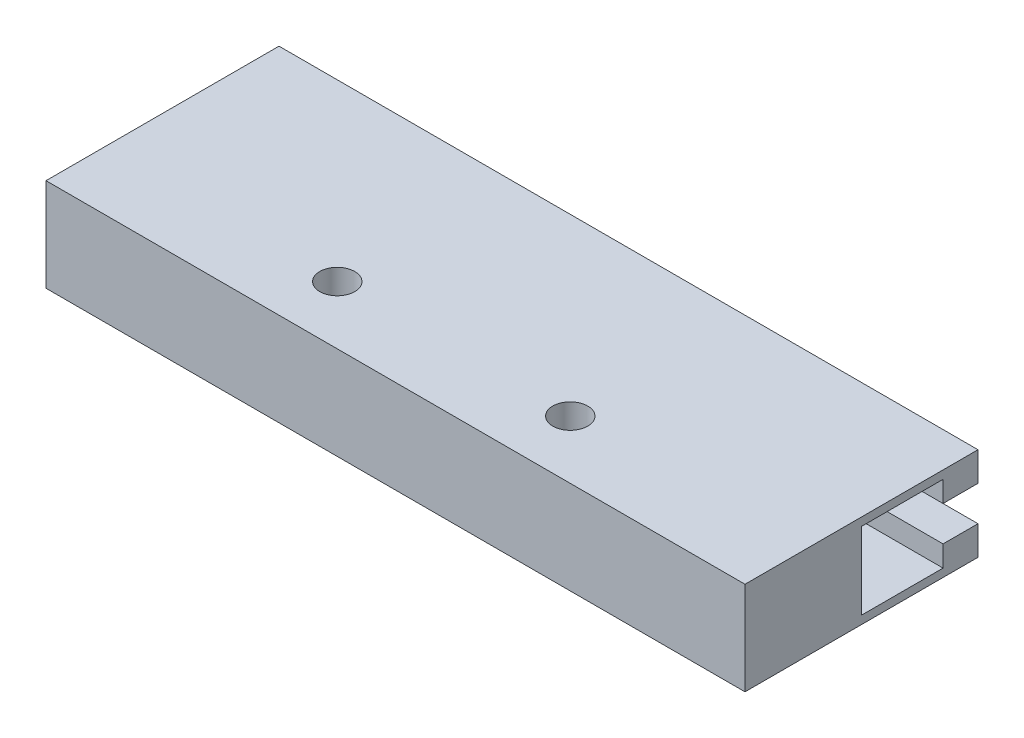
ISO-10303-21;
HEADER;
FILE_DESCRIPTION(('STEP AP214'),'2;1');
FILE_NAME('part.step','',(''),(''),'','','');
FILE_SCHEMA(('AUTOMOTIVE_DESIGN { 1 0 10303 214 1 1 1 1 }'));
ENDSEC;
DATA;
#1=APPLICATION_CONTEXT('core data for automotive mechanical design processes');
#2=APPLICATION_PROTOCOL_DEFINITION('international standard','automotive_design',2000,#1);
#3=PRODUCT_CONTEXT('',#1,'mechanical');
#4=PRODUCT('Part','Part','',(#3));
#5=PRODUCT_RELATED_PRODUCT_CATEGORY('part','',(#4));
#6=PRODUCT_DEFINITION_FORMATION('','',#4);
#7=PRODUCT_DEFINITION_CONTEXT('part definition',#1,'design');
#8=PRODUCT_DEFINITION('design','',#6,#7);
#9=PRODUCT_DEFINITION_SHAPE('','',#8);
#10=(LENGTH_UNIT() NAMED_UNIT(*) SI_UNIT(.MILLI.,.METRE.));
#11=(NAMED_UNIT(*) PLANE_ANGLE_UNIT() SI_UNIT($,.RADIAN.));
#12=(NAMED_UNIT(*) SI_UNIT($,.STERADIAN.) SOLID_ANGLE_UNIT());
#13=UNCERTAINTY_MEASURE_WITH_UNIT(LENGTH_MEASURE(1.E-05),#10,'distance_accuracy_value','');
#14=(GEOMETRIC_REPRESENTATION_CONTEXT(3) GLOBAL_UNCERTAINTY_ASSIGNED_CONTEXT((#13)) GLOBAL_UNIT_ASSIGNED_CONTEXT((#10,
#11,#12)) REPRESENTATION_CONTEXT('',''));
#15=CARTESIAN_POINT('',(0.,0.,0.));
#16=DIRECTION('',(0.,0.,1.));
#17=DIRECTION('',(1.,0.,0.));
#18=AXIS2_PLACEMENT_3D('',#15,#16,#17);
#19=CARTESIAN_POINT('',(0.,0.,0.));
#20=DIRECTION('',(0.,0.,-1.));
#21=DIRECTION('',(-1.,0.,0.));
#22=AXIS2_PLACEMENT_3D('',#19,#20,#21);
#23=PLANE('',#22);
#24=DIRECTION('',(1.,0.,0.));
#25=VECTOR('',#24,1.);
#26=CARTESIAN_POINT('',(0.,-5.5,0.));
#27=LINE('',#26,#25);
#28=CARTESIAN_POINT('',(0.,-5.5,0.));
#29=VERTEX_POINT('',#28);
#30=CARTESIAN_POINT('',(60.,-5.5,0.));
#31=VERTEX_POINT('',#30);
#32=EDGE_CURVE('E215',#29,#31,#27,.T.);
#33=ORIENTED_EDGE('',*,*,#32,.T.);
#34=DIRECTION('',(0.,1.,0.));
#35=VECTOR('',#34,1.);
#36=CARTESIAN_POINT('',(60.,0.,0.));
#37=LINE('',#36,#35);
#38=CARTESIAN_POINT('',(60.,-8.,0.));
#39=VERTEX_POINT('',#38);
#40=EDGE_CURVE('E253',#39,#31,#37,.T.);
#41=ORIENTED_EDGE('',*,*,#40,.F.);
#42=DIRECTION('',(1.,0.,0.));
#43=VECTOR('',#42,1.);
#44=CARTESIAN_POINT('',(60.,-8.,0.));
#45=LINE('',#44,#43);
#46=CARTESIAN_POINT('',(0.,-7.99999999999999,0.));
#47=VERTEX_POINT('',#46);
#48=EDGE_CURVE('E249',#47,#39,#45,.T.);
#49=ORIENTED_EDGE('',*,*,#48,.F.);
#50=DIRECTION('',(0.,-1.,0.));
#51=VECTOR('',#50,1.);
#52=CARTESIAN_POINT('',(0.,-7.99999999999999,0.));
#53=LINE('',#52,#51);
#54=EDGE_CURVE('E219',#29,#47,#53,.T.);
#55=ORIENTED_EDGE('',*,*,#54,.F.);
#56=EDGE_LOOP('',(#33,#41,#49,#55));
#57=FACE_BOUND('',#56,.T.);
#58=ADVANCED_FACE('F45',(#57),#23,.T.);
#59=CARTESIAN_POINT('',(0.,-7.99999999999999,20.));
#60=DIRECTION('',(1.,0.,0.));
#61=DIRECTION('',(0.,0.,-1.));
#62=AXIS2_PLACEMENT_3D('',#59,#60,#61);
#63=PLANE('',#62);
#64=DIRECTION('',(0.,1.,0.));
#65=VECTOR('',#64,1.);
#66=CARTESIAN_POINT('',(0.,-7.3,3.));
#67=LINE('',#66,#65);
#68=CARTESIAN_POINT('',(0.,-7.3,3.));
#69=VERTEX_POINT('',#68);
#70=CARTESIAN_POINT('',(0.,-5.5,3.));
#71=VERTEX_POINT('',#70);
#72=EDGE_CURVE('E187',#69,#71,#67,.T.);
#73=ORIENTED_EDGE('',*,*,#72,.T.);
#74=DIRECTION('',(0.,0.,-1.));
#75=VECTOR('',#74,1.);
#76=CARTESIAN_POINT('',(0.,-5.5,3.));
#77=LINE('',#76,#75);
#78=EDGE_CURVE('E190',#71,#29,#77,.T.);
#79=ORIENTED_EDGE('',*,*,#78,.T.);
#80=ORIENTED_EDGE('',*,*,#54,.T.);
#81=DIRECTION('',(0.,0.,-1.));
#82=VECTOR('',#81,1.);
#83=CARTESIAN_POINT('',(0.,-7.99999999999999,20.));
#84=LINE('',#83,#82);
#85=CARTESIAN_POINT('',(0.,-7.99999999999999,20.));
#86=VERTEX_POINT('',#85);
#87=EDGE_CURVE('E11',#86,#47,#84,.T.);
#88=ORIENTED_EDGE('',*,*,#87,.F.);
#89=DIRECTION('',(0.,-1.,0.));
#90=VECTOR('',#89,1.);
#91=CARTESIAN_POINT('',(0.,-7.99999999999999,20.));
#92=LINE('',#91,#90);
#93=CARTESIAN_POINT('',(0.,0.,20.));
#94=VERTEX_POINT('',#93);
#95=EDGE_CURVE('E236',#94,#86,#92,.T.);
#96=ORIENTED_EDGE('',*,*,#95,.F.);
#97=DIRECTION('',(0.,0.,-1.));
#98=VECTOR('',#97,1.);
#99=CARTESIAN_POINT('',(0.,0.,20.));
#100=LINE('',#99,#98);
#101=CARTESIAN_POINT('',(0.,0.,0.));
#102=VERTEX_POINT('',#101);
#103=EDGE_CURVE('E246',#94,#102,#100,.T.);
#104=ORIENTED_EDGE('',*,*,#103,.T.);
#105=CARTESIAN_POINT('',(0.,-2.49999999999999,0.));
#106=VERTEX_POINT('',#105);
#107=EDGE_CURVE('E166',#102,#106,#53,.T.);
#108=ORIENTED_EDGE('',*,*,#107,.T.);
#109=DIRECTION('',(0.,0.,1.));
#110=VECTOR('',#109,1.);
#111=CARTESIAN_POINT('',(0.,-2.49999999999999,0.));
#112=LINE('',#111,#110);
#113=CARTESIAN_POINT('',(0.,-2.49999999999999,3.));
#114=VERTEX_POINT('',#113);
#115=EDGE_CURVE('E61',#106,#114,#112,.T.);
#116=ORIENTED_EDGE('',*,*,#115,.T.);
#117=DIRECTION('',(0.,1.,0.));
#118=VECTOR('',#117,1.);
#119=CARTESIAN_POINT('',(0.,-2.49999999999999,3.));
#120=LINE('',#119,#118);
#121=CARTESIAN_POINT('',(0.,-0.699999999999995,3.));
#122=VERTEX_POINT('',#121);
#123=EDGE_CURVE('E155',#114,#122,#120,.T.);
#124=ORIENTED_EDGE('',*,*,#123,.T.);
#125=DIRECTION('',(0.,0.,1.));
#126=VECTOR('',#125,1.);
#127=CARTESIAN_POINT('',(0.,-0.699999999999995,3.));
#128=LINE('',#127,#126);
#129=CARTESIAN_POINT('',(0.,-0.699999999999995,10.));
#130=VERTEX_POINT('',#129);
#131=EDGE_CURVE('E161',#122,#130,#128,.T.);
#132=ORIENTED_EDGE('',*,*,#131,.T.);
#133=DIRECTION('',(0.,-1.,0.));
#134=VECTOR('',#133,1.);
#135=CARTESIAN_POINT('',(0.,-0.699999999999995,10.));
#136=LINE('',#135,#134);
#137=CARTESIAN_POINT('',(0.,-7.3,10.));
#138=VERTEX_POINT('',#137);
#139=EDGE_CURVE('E179',#130,#138,#136,.T.);
#140=ORIENTED_EDGE('',*,*,#139,.T.);
#141=DIRECTION('',(0.,0.,-1.));
#142=VECTOR('',#141,1.);
#143=CARTESIAN_POINT('',(0.,-7.3,10.));
#144=LINE('',#143,#142);
#145=EDGE_CURVE('E183',#138,#69,#144,.T.);
#146=ORIENTED_EDGE('',*,*,#145,.T.);
#147=EDGE_LOOP('',(#73,#79,#80,#88,#96,#104,#108,#116,#124,#132,#140,#146));
#148=FACE_BOUND('',#147,.T.);
#149=ADVANCED_FACE('F47',(#148),#63,.F.);
#150=CARTESIAN_POINT('',(60.,-8.,20.));
#151=DIRECTION('',(0.,1.,0.));
#152=DIRECTION('',(-1.,0.,0.));
#153=AXIS2_PLACEMENT_3D('',#150,#151,#152);
#154=PLANE('',#153);
#155=CARTESIAN_POINT('',(40.,-8.,15.));
#156=DIRECTION('',(0.,1.,0.));
#157=DIRECTION('',(0.,0.,1.));
#158=AXIS2_PLACEMENT_3D('',#155,#156,#157);
#159=CIRCLE('',#158,1.5);
#160=CARTESIAN_POINT('',(40.,-8.,16.5));
#161=VERTEX_POINT('',#160);
#162=EDGE_CURVE('E197',#161,#161,#159,.T.);
#163=ORIENTED_EDGE('',*,*,#162,.T.);
#164=EDGE_LOOP('',(#163));
#165=FACE_BOUND('',#164,.T.);
#166=CARTESIAN_POINT('',(20.,-8.,15.));
#167=DIRECTION('',(0.,1.,0.));
#168=DIRECTION('',(0.,0.,1.));
#169=AXIS2_PLACEMENT_3D('',#166,#167,#168);
#170=CIRCLE('',#169,1.5);
#171=CARTESIAN_POINT('',(20.,-8.,16.5));
#172=VERTEX_POINT('',#171);
#173=EDGE_CURVE('E174',#172,#172,#170,.T.);
#174=ORIENTED_EDGE('',*,*,#173,.T.);
#175=EDGE_LOOP('',(#174));
#176=FACE_BOUND('',#175,.T.);
#177=ORIENTED_EDGE('',*,*,#48,.T.);
#178=DIRECTION('',(0.,0.,-1.));
#179=VECTOR('',#178,1.);
#180=CARTESIAN_POINT('',(60.,-8.,20.));
#181=LINE('',#180,#179);
#182=CARTESIAN_POINT('',(60.,-8.,20.));
#183=VERTEX_POINT('',#182);
#184=EDGE_CURVE('E54',#183,#39,#181,.T.);
#185=ORIENTED_EDGE('',*,*,#184,.F.);
#186=DIRECTION('',(1.,0.,0.));
#187=VECTOR('',#186,1.);
#188=CARTESIAN_POINT('',(60.,-8.,20.));
#189=LINE('',#188,#187);
#190=EDGE_CURVE('E98',#86,#183,#189,.T.);
#191=ORIENTED_EDGE('',*,*,#190,.F.);
#192=ORIENTED_EDGE('',*,*,#87,.T.);
#193=EDGE_LOOP('',(#177,#185,#191,#192));
#194=FACE_BOUND('',#193,.T.);
#195=ADVANCED_FACE('F314',(#165,#176,#194),#154,.F.);
#196=CARTESIAN_POINT('',(60.,0.,20.));
#197=DIRECTION('',(-1.,0.,0.));
#198=DIRECTION('',(0.,0.,1.));
#199=AXIS2_PLACEMENT_3D('',#196,#197,#198);
#200=PLANE('',#199);
#201=ORIENTED_EDGE('',*,*,#40,.T.);
#202=DIRECTION('',(0.,0.,-1.));
#203=VECTOR('',#202,1.);
#204=CARTESIAN_POINT('',(60.,-5.5,3.));
#205=LINE('',#204,#203);
#206=CARTESIAN_POINT('',(60.,-5.5,3.));
#207=VERTEX_POINT('',#206);
#208=EDGE_CURVE('E168',#207,#31,#205,.T.);
#209=ORIENTED_EDGE('',*,*,#208,.F.);
#210=DIRECTION('',(0.,1.,0.));
#211=VECTOR('',#210,1.);
#212=CARTESIAN_POINT('',(60.,-7.3,3.));
#213=LINE('',#212,#211);
#214=CARTESIAN_POINT('',(60.,-7.3,3.));
#215=VERTEX_POINT('',#214);
#216=EDGE_CURVE('E171',#215,#207,#213,.T.);
#217=ORIENTED_EDGE('',*,*,#216,.F.);
#218=DIRECTION('',(0.,0.,-1.));
#219=VECTOR('',#218,1.);
#220=CARTESIAN_POINT('',(60.,-7.3,10.));
#221=LINE('',#220,#219);
#222=CARTESIAN_POINT('',(60.,-7.3,10.));
#223=VERTEX_POINT('',#222);
#224=EDGE_CURVE('E208',#223,#215,#221,.T.);
#225=ORIENTED_EDGE('',*,*,#224,.F.);
#226=DIRECTION('',(0.,-1.,0.));
#227=VECTOR('',#226,1.);
#228=CARTESIAN_POINT('',(60.,-0.699999999999995,10.));
#229=LINE('',#228,#227);
#230=CARTESIAN_POINT('',(60.,-0.699999999999995,10.));
#231=VERTEX_POINT('',#230);
#232=EDGE_CURVE('E204',#231,#223,#229,.T.);
#233=ORIENTED_EDGE('',*,*,#232,.F.);
#234=DIRECTION('',(0.,0.,1.));
#235=VECTOR('',#234,1.);
#236=CARTESIAN_POINT('',(60.,-0.699999999999995,3.));
#237=LINE('',#236,#235);
#238=CARTESIAN_POINT('',(60.,-0.699999999999995,3.));
#239=VERTEX_POINT('',#238);
#240=EDGE_CURVE('E200',#239,#231,#237,.T.);
#241=ORIENTED_EDGE('',*,*,#240,.F.);
#242=DIRECTION('',(0.,1.,0.));
#243=VECTOR('',#242,1.);
#244=CARTESIAN_POINT('',(60.,-2.49999999999999,3.));
#245=LINE('',#244,#243);
#246=CARTESIAN_POINT('',(60.,-2.49999999999999,3.));
#247=VERTEX_POINT('',#246);
#248=EDGE_CURVE('E196',#247,#239,#245,.T.);
#249=ORIENTED_EDGE('',*,*,#248,.F.);
#250=DIRECTION('',(0.,0.,1.));
#251=VECTOR('',#250,1.);
#252=CARTESIAN_POINT('',(60.,-2.49999999999999,0.));
#253=LINE('',#252,#251);
#254=CARTESIAN_POINT('',(60.,-2.49999999999999,0.));
#255=VERTEX_POINT('',#254);
#256=EDGE_CURVE('E146',#255,#247,#253,.T.);
#257=ORIENTED_EDGE('',*,*,#256,.F.);
#258=CARTESIAN_POINT('',(60.,0.,0.));
#259=VERTEX_POINT('',#258);
#260=EDGE_CURVE('E252',#255,#259,#37,.T.);
#261=ORIENTED_EDGE('',*,*,#260,.T.);
#262=DIRECTION('',(0.,0.,-1.));
#263=VECTOR('',#262,1.);
#264=CARTESIAN_POINT('',(60.,0.,20.));
#265=LINE('',#264,#263);
#266=CARTESIAN_POINT('',(60.,0.,20.));
#267=VERTEX_POINT('',#266);
#268=EDGE_CURVE('E261',#267,#259,#265,.T.);
#269=ORIENTED_EDGE('',*,*,#268,.F.);
#270=DIRECTION('',(0.,1.,0.));
#271=VECTOR('',#270,1.);
#272=CARTESIAN_POINT('',(60.,0.,20.));
#273=LINE('',#272,#271);
#274=EDGE_CURVE('E241',#183,#267,#273,.T.);
#275=ORIENTED_EDGE('',*,*,#274,.F.);
#276=ORIENTED_EDGE('',*,*,#184,.T.);
#277=EDGE_LOOP('',(#201,#209,#217,#225,#233,#241,#249,#257,#261,#269,#275,#276));
#278=FACE_BOUND('',#277,.T.);
#279=ADVANCED_FACE('F268',(#278),#200,.F.);
#280=CARTESIAN_POINT('',(0.,0.,20.));
#281=DIRECTION('',(0.,-1.,0.));
#282=DIRECTION('',(0.,0.,-1.));
#283=AXIS2_PLACEMENT_3D('',#280,#281,#282);
#284=PLANE('',#283);
#285=CARTESIAN_POINT('',(40.,0.,15.));
#286=DIRECTION('',(0.,1.,0.));
#287=DIRECTION('',(0.,0.,1.));
#288=AXIS2_PLACEMENT_3D('',#285,#286,#287);
#289=CIRCLE('',#288,1.5);
#290=CARTESIAN_POINT('',(40.,0.,16.5));
#291=VERTEX_POINT('',#290);
#292=EDGE_CURVE('E333',#291,#291,#289,.T.);
#293=ORIENTED_EDGE('',*,*,#292,.F.);
#294=EDGE_LOOP('',(#293));
#295=FACE_BOUND('',#294,.T.);
#296=CARTESIAN_POINT('',(20.,0.,15.));
#297=DIRECTION('',(0.,1.,0.));
#298=DIRECTION('',(0.,0.,1.));
#299=AXIS2_PLACEMENT_3D('',#296,#297,#298);
#300=CIRCLE('',#299,1.5);
#301=CARTESIAN_POINT('',(20.,0.,16.5));
#302=VERTEX_POINT('',#301);
#303=EDGE_CURVE('E336',#302,#302,#300,.T.);
#304=ORIENTED_EDGE('',*,*,#303,.F.);
#305=EDGE_LOOP('',(#304));
#306=FACE_BOUND('',#305,.T.);
#307=DIRECTION('',(-1.,0.,0.));
#308=VECTOR('',#307,1.);
#309=CARTESIAN_POINT('',(0.,0.,0.));
#310=LINE('',#309,#308);
#311=EDGE_CURVE('E91',#259,#102,#310,.T.);
#312=ORIENTED_EDGE('',*,*,#311,.T.);
#313=ORIENTED_EDGE('',*,*,#103,.F.);
#314=DIRECTION('',(-1.,0.,0.));
#315=VECTOR('',#314,1.);
#316=CARTESIAN_POINT('',(0.,0.,20.));
#317=LINE('',#316,#315);
#318=EDGE_CURVE('E70',#267,#94,#317,.T.);
#319=ORIENTED_EDGE('',*,*,#318,.F.);
#320=ORIENTED_EDGE('',*,*,#268,.T.);
#321=EDGE_LOOP('',(#312,#313,#319,#320));
#322=FACE_BOUND('',#321,.T.);
#323=ADVANCED_FACE('F307',(#295,#306,#322),#284,.F.);
#324=CARTESIAN_POINT('',(0.,0.,20.));
#325=DIRECTION('',(0.,0.,-1.));
#326=DIRECTION('',(-1.,0.,0.));
#327=AXIS2_PLACEMENT_3D('',#324,#325,#326);
#328=PLANE('',#327);
#329=ORIENTED_EDGE('',*,*,#95,.T.);
#330=ORIENTED_EDGE('',*,*,#190,.T.);
#331=ORIENTED_EDGE('',*,*,#274,.T.);
#332=ORIENTED_EDGE('',*,*,#318,.T.);
#333=EDGE_LOOP('',(#329,#330,#331,#332));
#334=FACE_BOUND('',#333,.T.);
#335=ADVANCED_FACE('F299',(#334),#328,.F.);
#336=DIRECTION('',(1.,0.,0.));
#337=VECTOR('',#336,1.);
#338=CARTESIAN_POINT('',(0.,-2.49999999999999,0.));
#339=LINE('',#338,#337);
#340=EDGE_CURVE('E152',#106,#255,#339,.T.);
#341=ORIENTED_EDGE('',*,*,#340,.F.);
#342=ORIENTED_EDGE('',*,*,#107,.F.);
#343=ORIENTED_EDGE('',*,*,#311,.F.);
#344=ORIENTED_EDGE('',*,*,#260,.F.);
#345=EDGE_LOOP('',(#341,#342,#343,#344));
#346=FACE_BOUND('',#345,.T.);
#347=ADVANCED_FACE('F295',(#346),#23,.T.);
#348=CARTESIAN_POINT('',(0.,-5.5,3.));
#349=DIRECTION('',(0.,-1.,0.));
#350=DIRECTION('',(0.,0.,-1.));
#351=AXIS2_PLACEMENT_3D('',#348,#349,#350);
#352=PLANE('',#351);
#353=ORIENTED_EDGE('',*,*,#208,.T.);
#354=ORIENTED_EDGE('',*,*,#32,.F.);
#355=ORIENTED_EDGE('',*,*,#78,.F.);
#356=DIRECTION('',(1.,0.,0.));
#357=VECTOR('',#356,1.);
#358=CARTESIAN_POINT('',(0.,-5.5,3.));
#359=LINE('',#358,#357);
#360=EDGE_CURVE('E220',#71,#207,#359,.T.);
#361=ORIENTED_EDGE('',*,*,#360,.T.);
#362=EDGE_LOOP('',(#353,#354,#355,#361));
#363=FACE_BOUND('',#362,.T.);
#364=ADVANCED_FACE('F276',(#363),#352,.F.);
#365=CARTESIAN_POINT('',(0.,-7.3,3.));
#366=DIRECTION('',(0.,0.,-1.));
#367=DIRECTION('',(-1.,0.,0.));
#368=AXIS2_PLACEMENT_3D('',#365,#366,#367);
#369=PLANE('',#368);
#370=ORIENTED_EDGE('',*,*,#216,.T.);
#371=ORIENTED_EDGE('',*,*,#360,.F.);
#372=ORIENTED_EDGE('',*,*,#72,.F.);
#373=DIRECTION('',(1.,0.,0.));
#374=VECTOR('',#373,1.);
#375=CARTESIAN_POINT('',(0.,-7.3,3.));
#376=LINE('',#375,#374);
#377=EDGE_CURVE('E223',#69,#215,#376,.T.);
#378=ORIENTED_EDGE('',*,*,#377,.T.);
#379=EDGE_LOOP('',(#370,#371,#372,#378));
#380=FACE_BOUND('',#379,.T.);
#381=ADVANCED_FACE('F281',(#380),#369,.F.);
#382=CARTESIAN_POINT('',(0.,-7.3,10.));
#383=DIRECTION('',(0.,-1.,0.));
#384=DIRECTION('',(0.,0.,-1.));
#385=AXIS2_PLACEMENT_3D('',#382,#383,#384);
#386=PLANE('',#385);
#387=ORIENTED_EDGE('',*,*,#224,.T.);
#388=ORIENTED_EDGE('',*,*,#377,.F.);
#389=ORIENTED_EDGE('',*,*,#145,.F.);
#390=DIRECTION('',(1.,0.,0.));
#391=VECTOR('',#390,1.);
#392=CARTESIAN_POINT('',(0.,-7.3,10.));
#393=LINE('',#392,#391);
#394=EDGE_CURVE('E226',#138,#223,#393,.T.);
#395=ORIENTED_EDGE('',*,*,#394,.T.);
#396=EDGE_LOOP('',(#387,#388,#389,#395));
#397=FACE_BOUND('',#396,.T.);
#398=ADVANCED_FACE('F287',(#397),#386,.F.);
#399=CARTESIAN_POINT('',(0.,-0.699999999999995,10.));
#400=DIRECTION('',(0.,0.,1.));
#401=DIRECTION('',(0.,-1.,0.));
#402=AXIS2_PLACEMENT_3D('',#399,#400,#401);
#403=PLANE('',#402);
#404=ORIENTED_EDGE('',*,*,#232,.T.);
#405=ORIENTED_EDGE('',*,*,#394,.F.);
#406=ORIENTED_EDGE('',*,*,#139,.F.);
#407=DIRECTION('',(1.,0.,0.));
#408=VECTOR('',#407,1.);
#409=CARTESIAN_POINT('',(0.,-0.699999999999995,10.));
#410=LINE('',#409,#408);
#411=EDGE_CURVE('E229',#130,#231,#410,.T.);
#412=ORIENTED_EDGE('',*,*,#411,.T.);
#413=EDGE_LOOP('',(#404,#405,#406,#412));
#414=FACE_BOUND('',#413,.T.);
#415=ADVANCED_FACE('F290',(#414),#403,.F.);
#416=CARTESIAN_POINT('',(0.,-0.699999999999995,3.));
#417=DIRECTION('',(0.,1.,0.));
#418=DIRECTION('',(0.,0.,1.));
#419=AXIS2_PLACEMENT_3D('',#416,#417,#418);
#420=PLANE('',#419);
#421=ORIENTED_EDGE('',*,*,#240,.T.);
#422=ORIENTED_EDGE('',*,*,#411,.F.);
#423=ORIENTED_EDGE('',*,*,#131,.F.);
#424=DIRECTION('',(1.,0.,0.));
#425=VECTOR('',#424,1.);
#426=CARTESIAN_POINT('',(0.,-0.699999999999995,3.));
#427=LINE('',#426,#425);
#428=EDGE_CURVE('E151',#122,#239,#427,.T.);
#429=ORIENTED_EDGE('',*,*,#428,.T.);
#430=EDGE_LOOP('',(#421,#422,#423,#429));
#431=FACE_BOUND('',#430,.T.);
#432=ADVANCED_FACE('F292',(#431),#420,.F.);
#433=CARTESIAN_POINT('',(0.,-2.49999999999999,3.));
#434=DIRECTION('',(0.,0.,-1.));
#435=DIRECTION('',(0.,1.,0.));
#436=AXIS2_PLACEMENT_3D('',#433,#434,#435);
#437=PLANE('',#436);
#438=ORIENTED_EDGE('',*,*,#248,.T.);
#439=ORIENTED_EDGE('',*,*,#428,.F.);
#440=ORIENTED_EDGE('',*,*,#123,.F.);
#441=DIRECTION('',(1.,0.,0.));
#442=VECTOR('',#441,1.);
#443=CARTESIAN_POINT('',(0.,-2.49999999999999,3.));
#444=LINE('',#443,#442);
#445=EDGE_CURVE('E142',#114,#247,#444,.T.);
#446=ORIENTED_EDGE('',*,*,#445,.T.);
#447=EDGE_LOOP('',(#438,#439,#440,#446));
#448=FACE_BOUND('',#447,.T.);
#449=ADVANCED_FACE('F156',(#448),#437,.F.);
#450=CARTESIAN_POINT('',(0.,-2.49999999999999,0.));
#451=DIRECTION('',(0.,1.,0.));
#452=DIRECTION('',(0.,0.,1.));
#453=AXIS2_PLACEMENT_3D('',#450,#451,#452);
#454=PLANE('',#453);
#455=ORIENTED_EDGE('',*,*,#256,.T.);
#456=ORIENTED_EDGE('',*,*,#445,.F.);
#457=ORIENTED_EDGE('',*,*,#115,.F.);
#458=ORIENTED_EDGE('',*,*,#340,.T.);
#459=EDGE_LOOP('',(#455,#456,#457,#458));
#460=FACE_BOUND('',#459,.T.);
#461=ADVANCED_FACE('F144',(#460),#454,.F.);
#462=CARTESIAN_POINT('',(20.,-8.,15.));
#463=DIRECTION('',(0.,1.,0.));
#464=DIRECTION('',(0.,0.,1.));
#465=AXIS2_PLACEMENT_3D('',#462,#463,#464);
#466=CYLINDRICAL_SURFACE('',#465,1.5);
#467=ORIENTED_EDGE('',*,*,#173,.F.);
#468=EDGE_LOOP('',(#467));
#469=FACE_BOUND('',#468,.T.);
#470=ORIENTED_EDGE('',*,*,#303,.T.);
#471=EDGE_LOOP('',(#470));
#472=FACE_BOUND('',#471,.T.);
#473=ADVANCED_FACE('F350',(#469,#472),#466,.F.);
#474=CARTESIAN_POINT('',(40.,-8.,15.));
#475=DIRECTION('',(0.,1.,0.));
#476=DIRECTION('',(0.,0.,1.));
#477=AXIS2_PLACEMENT_3D('',#474,#475,#476);
#478=CYLINDRICAL_SURFACE('',#477,1.5);
#479=ORIENTED_EDGE('',*,*,#162,.F.);
#480=EDGE_LOOP('',(#479));
#481=FACE_BOUND('',#480,.T.);
#482=ORIENTED_EDGE('',*,*,#292,.T.);
#483=EDGE_LOOP('',(#482));
#484=FACE_BOUND('',#483,.T.);
#485=ADVANCED_FACE('F347',(#481,#484),#478,.F.);
#486=CLOSED_SHELL('',(#58,#149,#195,#279,#323,#335,#347,#364,#381,#398,#415,#432,#449,#461,#473,#485));
#487=MANIFOLD_SOLID_BREP('B2',#486);
#488=ADVANCED_BREP_SHAPE_REPRESENTATION('',(#18,#487),#14);
#489=SHAPE_DEFINITION_REPRESENTATION(#9,#488);
ENDSEC;
END-ISO-10303-21;
